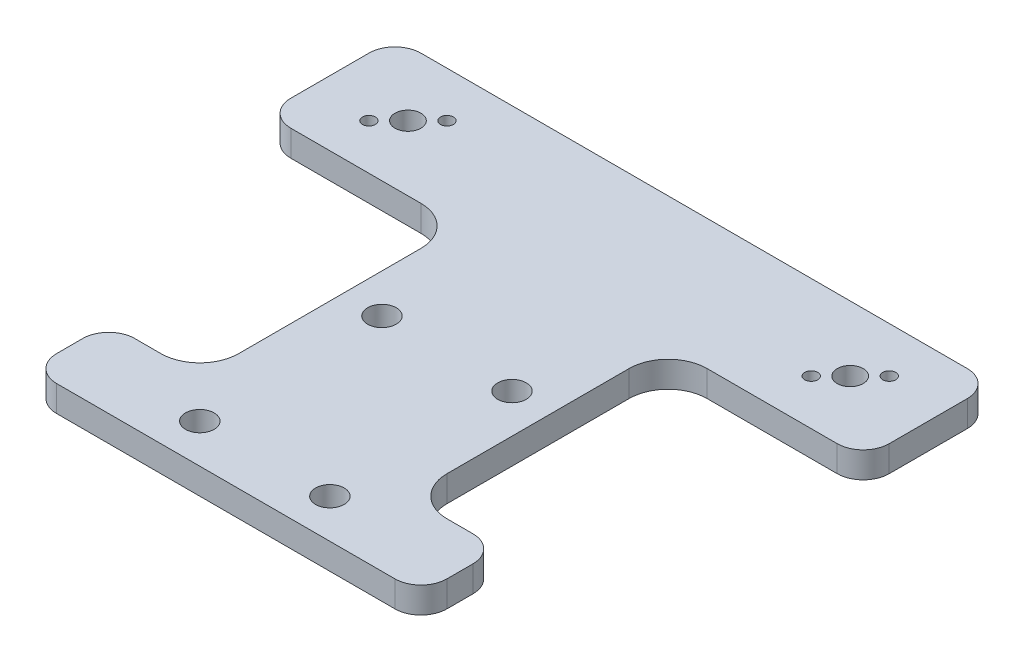
ISO-10303-21;
HEADER;
FILE_DESCRIPTION(('STEP AP214'),'2;1');
FILE_NAME('part.step','',(''),(''),'','','');
FILE_SCHEMA(('AUTOMOTIVE_DESIGN { 1 0 10303 214 1 1 1 1 }'));
ENDSEC;
DATA;
#1=APPLICATION_CONTEXT('core data for automotive mechanical design processes');
#2=APPLICATION_PROTOCOL_DEFINITION('international standard','automotive_design',2000,#1);
#3=PRODUCT_CONTEXT('',#1,'mechanical');
#4=PRODUCT('Part','Part','',(#3));
#5=PRODUCT_RELATED_PRODUCT_CATEGORY('part','',(#4));
#6=PRODUCT_DEFINITION_FORMATION('','',#4);
#7=PRODUCT_DEFINITION_CONTEXT('part definition',#1,'design');
#8=PRODUCT_DEFINITION('design','',#6,#7);
#9=PRODUCT_DEFINITION_SHAPE('','',#8);
#10=(LENGTH_UNIT() NAMED_UNIT(*) SI_UNIT(.MILLI.,.METRE.));
#11=(NAMED_UNIT(*) PLANE_ANGLE_UNIT() SI_UNIT($,.RADIAN.));
#12=(NAMED_UNIT(*) SI_UNIT($,.STERADIAN.) SOLID_ANGLE_UNIT());
#13=UNCERTAINTY_MEASURE_WITH_UNIT(LENGTH_MEASURE(1.E-05),#10,'distance_accuracy_value','');
#14=(GEOMETRIC_REPRESENTATION_CONTEXT(3) GLOBAL_UNCERTAINTY_ASSIGNED_CONTEXT((#13)) GLOBAL_UNIT_ASSIGNED_CONTEXT((#10,
#11,#12)) REPRESENTATION_CONTEXT('',''));
#15=CARTESIAN_POINT('',(0.,0.,0.));
#16=DIRECTION('',(0.,0.,1.));
#17=DIRECTION('',(1.,0.,0.));
#18=AXIS2_PLACEMENT_3D('',#15,#16,#17);
#19=CARTESIAN_POINT('',(55.,0.,-25.));
#20=DIRECTION('',(0.,-1.,0.));
#21=DIRECTION('',(0.,0.,-1.));
#22=AXIS2_PLACEMENT_3D('',#19,#20,#21);
#23=PLANE('',#22);
#24=CARTESIAN_POINT('',(25.,0.,4.99999999999999));
#25=DIRECTION('',(0.,-1.,0.));
#26=DIRECTION('',(0.,0.,-1.));
#27=AXIS2_PLACEMENT_3D('',#24,#25,#26);
#28=CIRCLE('',#27,5.49999999999999);
#29=CARTESIAN_POINT('',(25.,0.,-0.499999999999997));
#30=VERTEX_POINT('',#29);
#31=EDGE_CURVE('E466',#30,#30,#28,.T.);
#32=ORIENTED_EDGE('',*,*,#31,.F.);
#33=EDGE_LOOP('',(#32));
#34=FACE_BOUND('',#33,.T.);
#35=CARTESIAN_POINT('',(25.,0.,75.));
#36=DIRECTION('',(0.,-1.,0.));
#37=DIRECTION('',(0.,0.,-1.));
#38=AXIS2_PLACEMENT_3D('',#35,#36,#37);
#39=CIRCLE('',#38,5.49999999999999);
#40=CARTESIAN_POINT('',(25.,0.,69.5));
#41=VERTEX_POINT('',#40);
#42=EDGE_CURVE('E468',#41,#41,#39,.T.);
#43=ORIENTED_EDGE('',*,*,#42,.F.);
#44=EDGE_LOOP('',(#43));
#45=FACE_BOUND('',#44,.T.);
#46=CARTESIAN_POINT('',(-25.,0.,4.99999999999999));
#47=DIRECTION('',(0.,-1.,0.));
#48=DIRECTION('',(0.,0.,-1.));
#49=AXIS2_PLACEMENT_3D('',#46,#47,#48);
#50=CIRCLE('',#49,5.49999999999999);
#51=CARTESIAN_POINT('',(-25.,0.,-0.499999999999997));
#52=VERTEX_POINT('',#51);
#53=EDGE_CURVE('E476',#52,#52,#50,.T.);
#54=ORIENTED_EDGE('',*,*,#53,.F.);
#55=EDGE_LOOP('',(#54));
#56=FACE_BOUND('',#55,.T.);
#57=CARTESIAN_POINT('',(-25.,0.,75.));
#58=DIRECTION('',(0.,-1.,0.));
#59=DIRECTION('',(0.,0.,-1.));
#60=AXIS2_PLACEMENT_3D('',#57,#58,#59);
#61=CIRCLE('',#60,5.49999999999999);
#62=CARTESIAN_POINT('',(-25.,0.,69.5));
#63=VERTEX_POINT('',#62);
#64=EDGE_CURVE('E482',#63,#63,#61,.T.);
#65=ORIENTED_EDGE('',*,*,#64,.F.);
#66=EDGE_LOOP('',(#65));
#67=FACE_BOUND('',#66,.T.);
#68=CARTESIAN_POINT('',(-77.5,0.,-72.5));
#69=DIRECTION('',(0.,-1.,0.));
#70=DIRECTION('',(0.,0.,-1.));
#71=AXIS2_PLACEMENT_3D('',#68,#69,#70);
#72=CIRCLE('',#71,2.5);
#73=CARTESIAN_POINT('',(-77.5,0.,-75.));
#74=VERTEX_POINT('',#73);
#75=EDGE_CURVE('E488',#74,#74,#72,.T.);
#76=ORIENTED_EDGE('',*,*,#75,.F.);
#77=EDGE_LOOP('',(#76));
#78=FACE_BOUND('',#77,.T.);
#79=CARTESIAN_POINT('',(-92.5,0.,-57.5));
#80=DIRECTION('',(0.,-1.,0.));
#81=DIRECTION('',(0.,0.,-1.));
#82=AXIS2_PLACEMENT_3D('',#79,#80,#81);
#83=CIRCLE('',#82,2.5);
#84=CARTESIAN_POINT('',(-92.5,0.,-60.));
#85=VERTEX_POINT('',#84);
#86=EDGE_CURVE('E494',#85,#85,#83,.T.);
#87=ORIENTED_EDGE('',*,*,#86,.F.);
#88=EDGE_LOOP('',(#87));
#89=FACE_BOUND('',#88,.T.);
#90=CARTESIAN_POINT('',(92.5,0.,-72.5));
#91=DIRECTION('',(0.,-1.,0.));
#92=DIRECTION('',(0.,0.,-1.));
#93=AXIS2_PLACEMENT_3D('',#90,#91,#92);
#94=CIRCLE('',#93,2.5);
#95=CARTESIAN_POINT('',(92.5,0.,-75.));
#96=VERTEX_POINT('',#95);
#97=EDGE_CURVE('E500',#96,#96,#94,.T.);
#98=ORIENTED_EDGE('',*,*,#97,.F.);
#99=EDGE_LOOP('',(#98));
#100=FACE_BOUND('',#99,.T.);
#101=CARTESIAN_POINT('',(77.5,0.,-57.5));
#102=DIRECTION('',(0.,-1.,0.));
#103=DIRECTION('',(0.,0.,-1.));
#104=AXIS2_PLACEMENT_3D('',#101,#102,#103);
#105=CIRCLE('',#104,2.5);
#106=CARTESIAN_POINT('',(77.5,0.,-60.));
#107=VERTEX_POINT('',#106);
#108=EDGE_CURVE('E506',#107,#107,#105,.T.);
#109=ORIENTED_EDGE('',*,*,#108,.F.);
#110=EDGE_LOOP('',(#109));
#111=FACE_BOUND('',#110,.T.);
#112=CARTESIAN_POINT('',(55.,0.,-25.));
#113=DIRECTION('',(0.,-1.,0.));
#114=DIRECTION('',(0.,0.,-1.));
#115=AXIS2_PLACEMENT_3D('',#112,#113,#114);
#116=CIRCLE('',#115,15.);
#117=CARTESIAN_POINT('',(40.,0.,-24.9999999999999));
#118=VERTEX_POINT('',#117);
#119=CARTESIAN_POINT('',(55.0000000000001,0.,-40.));
#120=VERTEX_POINT('',#119);
#121=EDGE_CURVE('E226',#118,#120,#116,.T.);
#122=ORIENTED_EDGE('',*,*,#121,.F.);
#123=DIRECTION('',(0.,0.,-1.));
#124=VECTOR('',#123,1.);
#125=CARTESIAN_POINT('',(40.,0.,-24.9999999999999));
#126=LINE('',#125,#124);
#127=CARTESIAN_POINT('',(40.,0.,44.9999999999999));
#128=VERTEX_POINT('',#127);
#129=EDGE_CURVE('E133',#128,#118,#126,.T.);
#130=ORIENTED_EDGE('',*,*,#129,.F.);
#131=CARTESIAN_POINT('',(55.,0.,45.));
#132=DIRECTION('',(0.,-1.,0.));
#133=DIRECTION('',(0.,0.,-1.));
#134=AXIS2_PLACEMENT_3D('',#131,#132,#133);
#135=CIRCLE('',#134,15.);
#136=CARTESIAN_POINT('',(55.0000000000001,0.,60.));
#137=VERTEX_POINT('',#136);
#138=EDGE_CURVE('E127',#137,#128,#135,.T.);
#139=ORIENTED_EDGE('',*,*,#138,.F.);
#140=DIRECTION('',(-1.,0.,0.));
#141=VECTOR('',#140,1.);
#142=CARTESIAN_POINT('',(55.0000000000001,0.,60.));
#143=LINE('',#142,#141);
#144=CARTESIAN_POINT('',(64.9999999999999,0.,60.));
#145=VERTEX_POINT('',#144);
#146=EDGE_CURVE('E216',#145,#137,#143,.T.);
#147=ORIENTED_EDGE('',*,*,#146,.F.);
#148=CARTESIAN_POINT('',(65.,0.,70.));
#149=DIRECTION('',(0.,1.,0.));
#150=DIRECTION('',(0.,0.,1.));
#151=AXIS2_PLACEMENT_3D('',#148,#149,#150);
#152=CIRCLE('',#151,10.);
#153=CARTESIAN_POINT('',(75.,0.,70.0000000000001));
#154=VERTEX_POINT('',#153);
#155=EDGE_CURVE('E268',#154,#145,#152,.T.);
#156=ORIENTED_EDGE('',*,*,#155,.F.);
#157=DIRECTION('',(0.,0.,-1.));
#158=VECTOR('',#157,1.);
#159=CARTESIAN_POINT('',(75.,0.,70.0000000000001));
#160=LINE('',#159,#158);
#161=CARTESIAN_POINT('',(75.,0.,79.9999999999999));
#162=VERTEX_POINT('',#161);
#163=EDGE_CURVE('E266',#162,#154,#160,.T.);
#164=ORIENTED_EDGE('',*,*,#163,.F.);
#165=CARTESIAN_POINT('',(65.,0.,80.));
#166=DIRECTION('',(0.,1.,0.));
#167=DIRECTION('',(0.,0.,-1.));
#168=AXIS2_PLACEMENT_3D('',#165,#166,#167);
#169=CIRCLE('',#168,10.);
#170=CARTESIAN_POINT('',(64.9999999999999,0.,90.));
#171=VERTEX_POINT('',#170);
#172=EDGE_CURVE('E264',#171,#162,#169,.T.);
#173=ORIENTED_EDGE('',*,*,#172,.F.);
#174=DIRECTION('',(1.,0.,0.));
#175=VECTOR('',#174,1.);
#176=CARTESIAN_POINT('',(-64.9999999999999,0.,90.));
#177=LINE('',#176,#175);
#178=CARTESIAN_POINT('',(-64.9999999999999,0.,90.));
#179=VERTEX_POINT('',#178);
#180=EDGE_CURVE('E262',#179,#171,#177,.T.);
#181=ORIENTED_EDGE('',*,*,#180,.F.);
#182=CARTESIAN_POINT('',(-65.,0.,80.));
#183=DIRECTION('',(0.,1.,0.));
#184=DIRECTION('',(0.,0.,1.));
#185=AXIS2_PLACEMENT_3D('',#182,#183,#184);
#186=CIRCLE('',#185,10.);
#187=CARTESIAN_POINT('',(-75.,0.,79.9999999999999));
#188=VERTEX_POINT('',#187);
#189=EDGE_CURVE('E260',#188,#179,#186,.T.);
#190=ORIENTED_EDGE('',*,*,#189,.F.);
#191=DIRECTION('',(0.,0.,1.));
#192=VECTOR('',#191,1.);
#193=CARTESIAN_POINT('',(-75.,0.,70.0000000000001));
#194=LINE('',#193,#192);
#195=CARTESIAN_POINT('',(-75.,0.,70.0000000000001));
#196=VERTEX_POINT('',#195);
#197=EDGE_CURVE('E258',#196,#188,#194,.T.);
#198=ORIENTED_EDGE('',*,*,#197,.F.);
#199=CARTESIAN_POINT('',(-65.,0.,70.));
#200=DIRECTION('',(0.,1.,0.));
#201=DIRECTION('',(0.,0.,1.));
#202=AXIS2_PLACEMENT_3D('',#199,#200,#201);
#203=CIRCLE('',#202,9.99999999999999);
#204=CARTESIAN_POINT('',(-64.9999999999999,0.,60.));
#205=VERTEX_POINT('',#204);
#206=EDGE_CURVE('E256',#205,#196,#203,.T.);
#207=ORIENTED_EDGE('',*,*,#206,.F.);
#208=DIRECTION('',(-1.,0.,0.));
#209=VECTOR('',#208,1.);
#210=CARTESIAN_POINT('',(-55.0000000000001,0.,60.));
#211=LINE('',#210,#209);
#212=CARTESIAN_POINT('',(-55.0000000000001,0.,60.));
#213=VERTEX_POINT('',#212);
#214=EDGE_CURVE('E254',#213,#205,#211,.T.);
#215=ORIENTED_EDGE('',*,*,#214,.F.);
#216=CARTESIAN_POINT('',(-55.,0.,45.));
#217=DIRECTION('',(0.,-1.,0.));
#218=DIRECTION('',(0.,0.,-1.));
#219=AXIS2_PLACEMENT_3D('',#216,#217,#218);
#220=CIRCLE('',#219,15.);
#221=CARTESIAN_POINT('',(-40.,0.,44.9999999999999));
#222=VERTEX_POINT('',#221);
#223=EDGE_CURVE('E252',#222,#213,#220,.T.);
#224=ORIENTED_EDGE('',*,*,#223,.F.);
#225=DIRECTION('',(0.,0.,1.));
#226=VECTOR('',#225,1.);
#227=CARTESIAN_POINT('',(-40.,0.,-24.9999999999999));
#228=LINE('',#227,#226);
#229=CARTESIAN_POINT('',(-40.,0.,-24.9999999999999));
#230=VERTEX_POINT('',#229);
#231=EDGE_CURVE('E250',#230,#222,#228,.T.);
#232=ORIENTED_EDGE('',*,*,#231,.F.);
#233=CARTESIAN_POINT('',(-55.,0.,-25.));
#234=DIRECTION('',(0.,-1.,0.));
#235=DIRECTION('',(0.,0.,-1.));
#236=AXIS2_PLACEMENT_3D('',#233,#234,#235);
#237=CIRCLE('',#236,15.);
#238=CARTESIAN_POINT('',(-55.0000000000001,0.,-40.));
#239=VERTEX_POINT('',#238);
#240=EDGE_CURVE('E248',#239,#230,#237,.T.);
#241=ORIENTED_EDGE('',*,*,#240,.F.);
#242=DIRECTION('',(1.,0.,0.));
#243=VECTOR('',#242,1.);
#244=CARTESIAN_POINT('',(-105.,0.,-40.));
#245=LINE('',#244,#243);
#246=CARTESIAN_POINT('',(-105.,0.,-40.));
#247=VERTEX_POINT('',#246);
#248=EDGE_CURVE('E246',#247,#239,#245,.T.);
#249=ORIENTED_EDGE('',*,*,#248,.F.);
#250=CARTESIAN_POINT('',(-105.,0.,-50.));
#251=DIRECTION('',(0.,1.,0.));
#252=DIRECTION('',(0.,0.,1.));
#253=AXIS2_PLACEMENT_3D('',#250,#251,#252);
#254=CIRCLE('',#253,9.99999999999999);
#255=CARTESIAN_POINT('',(-115.,0.,-50.0000000000001));
#256=VERTEX_POINT('',#255);
#257=EDGE_CURVE('E244',#256,#247,#254,.T.);
#258=ORIENTED_EDGE('',*,*,#257,.F.);
#259=DIRECTION('',(0.,0.,1.));
#260=VECTOR('',#259,1.);
#261=CARTESIAN_POINT('',(-115.,0.,-79.9999999999999));
#262=LINE('',#261,#260);
#263=CARTESIAN_POINT('',(-115.,0.,-79.9999999999999));
#264=VERTEX_POINT('',#263);
#265=EDGE_CURVE('E242',#264,#256,#262,.T.);
#266=ORIENTED_EDGE('',*,*,#265,.F.);
#267=CARTESIAN_POINT('',(-105.,0.,-80.));
#268=DIRECTION('',(0.,1.,0.));
#269=DIRECTION('',(0.,0.,1.));
#270=AXIS2_PLACEMENT_3D('',#267,#268,#269);
#271=CIRCLE('',#270,9.99999999999999);
#272=CARTESIAN_POINT('',(-105.,0.,-90.));
#273=VERTEX_POINT('',#272);
#274=EDGE_CURVE('E240',#273,#264,#271,.T.);
#275=ORIENTED_EDGE('',*,*,#274,.F.);
#276=DIRECTION('',(-1.,0.,0.));
#277=VECTOR('',#276,1.);
#278=CARTESIAN_POINT('',(-105.,0.,-90.));
#279=LINE('',#278,#277);
#280=CARTESIAN_POINT('',(105.,0.,-90.));
#281=VERTEX_POINT('',#280);
#282=EDGE_CURVE('E238',#281,#273,#279,.T.);
#283=ORIENTED_EDGE('',*,*,#282,.F.);
#284=CARTESIAN_POINT('',(105.,0.,-80.));
#285=DIRECTION('',(0.,1.,0.));
#286=DIRECTION('',(0.,0.,1.));
#287=AXIS2_PLACEMENT_3D('',#284,#285,#286);
#288=CIRCLE('',#287,9.99999999999999);
#289=CARTESIAN_POINT('',(115.,0.,-79.9999999999999));
#290=VERTEX_POINT('',#289);
#291=EDGE_CURVE('E236',#290,#281,#288,.T.);
#292=ORIENTED_EDGE('',*,*,#291,.F.);
#293=DIRECTION('',(0.,0.,-1.));
#294=VECTOR('',#293,1.);
#295=CARTESIAN_POINT('',(115.,0.,-79.9999999999999));
#296=LINE('',#295,#294);
#297=CARTESIAN_POINT('',(115.,0.,-50.0000000000001));
#298=VERTEX_POINT('',#297);
#299=EDGE_CURVE('E234',#298,#290,#296,.T.);
#300=ORIENTED_EDGE('',*,*,#299,.F.);
#301=CARTESIAN_POINT('',(105.,0.,-50.));
#302=DIRECTION('',(0.,1.,0.));
#303=DIRECTION('',(0.,0.,1.));
#304=AXIS2_PLACEMENT_3D('',#301,#302,#303);
#305=CIRCLE('',#304,9.99999999999999);
#306=CARTESIAN_POINT('',(105.,0.,-40.));
#307=VERTEX_POINT('',#306);
#308=EDGE_CURVE('E232',#307,#298,#305,.T.);
#309=ORIENTED_EDGE('',*,*,#308,.F.);
#310=DIRECTION('',(1.,0.,0.));
#311=VECTOR('',#310,1.);
#312=CARTESIAN_POINT('',(105.,0.,-40.));
#313=LINE('',#312,#311);
#314=EDGE_CURVE('E229',#120,#307,#313,.T.);
#315=ORIENTED_EDGE('',*,*,#314,.F.);
#316=EDGE_LOOP('',(#122,#130,#139,#147,#156,#164,#173,#181,#190,#198,#207,#215,#224,#232,#241,
#249,#258,#266,#275,#283,#292,#300,#309,#315));
#317=FACE_BOUND('',#316,.T.);
#318=CARTESIAN_POINT('',(85.,0.,-65.));
#319=DIRECTION('',(0.,1.,0.));
#320=DIRECTION('',(0.,0.,1.));
#321=AXIS2_PLACEMENT_3D('',#318,#319,#320);
#322=CIRCLE('',#321,5.);
#323=CARTESIAN_POINT('',(85.,0.,-60.));
#324=VERTEX_POINT('',#323);
#325=EDGE_CURVE('E230',#324,#324,#322,.T.);
#326=ORIENTED_EDGE('',*,*,#325,.T.);
#327=EDGE_LOOP('',(#326));
#328=FACE_BOUND('',#327,.T.);
#329=CARTESIAN_POINT('',(-85.,0.,-65.));
#330=DIRECTION('',(0.,1.,0.));
#331=DIRECTION('',(0.,0.,1.));
#332=AXIS2_PLACEMENT_3D('',#329,#330,#331);
#333=CIRCLE('',#332,5.);
#334=CARTESIAN_POINT('',(-85.,0.,-60.));
#335=VERTEX_POINT('',#334);
#336=EDGE_CURVE('E515',#335,#335,#333,.T.);
#337=ORIENTED_EDGE('',*,*,#336,.T.);
#338=EDGE_LOOP('',(#337));
#339=FACE_BOUND('',#338,.T.);
#340=ADVANCED_FACE('F33',(#34,#45,#56,#67,#78,#89,#100,#111,#317,#328,#339),#23,.T.);
#341=CARTESIAN_POINT('',(55.,10.,-25.));
#342=DIRECTION('',(0.,-1.,0.));
#343=DIRECTION('',(0.,0.,-1.));
#344=AXIS2_PLACEMENT_3D('',#341,#342,#343);
#345=CYLINDRICAL_SURFACE('',#344,15.);
#346=ORIENTED_EDGE('',*,*,#121,.T.);
#347=DIRECTION('',(0.,-1.,0.));
#348=VECTOR('',#347,1.);
#349=CARTESIAN_POINT('',(55.0000000000001,10.,-40.));
#350=LINE('',#349,#348);
#351=CARTESIAN_POINT('',(55.0000000000001,10.,-40.));
#352=VERTEX_POINT('',#351);
#353=EDGE_CURVE('E11',#352,#120,#350,.T.);
#354=ORIENTED_EDGE('',*,*,#353,.F.);
#355=CARTESIAN_POINT('',(55.,10.,-25.));
#356=DIRECTION('',(0.,-1.,0.));
#357=DIRECTION('',(0.,0.,-1.));
#358=AXIS2_PLACEMENT_3D('',#355,#356,#357);
#359=CIRCLE('',#358,15.);
#360=CARTESIAN_POINT('',(40.,10.,-24.9999999999999));
#361=VERTEX_POINT('',#360);
#362=EDGE_CURVE('E273',#361,#352,#359,.T.);
#363=ORIENTED_EDGE('',*,*,#362,.F.);
#364=DIRECTION('',(0.,-1.,0.));
#365=VECTOR('',#364,1.);
#366=CARTESIAN_POINT('',(40.,10.,-24.9999999999999));
#367=LINE('',#366,#365);
#368=EDGE_CURVE('E222',#361,#118,#367,.T.);
#369=ORIENTED_EDGE('',*,*,#368,.T.);
#370=EDGE_LOOP('',(#346,#354,#363,#369));
#371=FACE_BOUND('',#370,.T.);
#372=ADVANCED_FACE('F35',(#371),#345,.F.);
#373=CARTESIAN_POINT('',(105.,10.,-40.));
#374=DIRECTION('',(0.,0.,-1.));
#375=DIRECTION('',(-1.,0.,0.));
#376=AXIS2_PLACEMENT_3D('',#373,#374,#375);
#377=PLANE('',#376);
#378=ORIENTED_EDGE('',*,*,#314,.T.);
#379=DIRECTION('',(0.,-1.,0.));
#380=VECTOR('',#379,1.);
#381=CARTESIAN_POINT('',(105.,10.,-40.));
#382=LINE('',#381,#380);
#383=CARTESIAN_POINT('',(105.,10.,-40.));
#384=VERTEX_POINT('',#383);
#385=EDGE_CURVE('E42',#384,#307,#382,.T.);
#386=ORIENTED_EDGE('',*,*,#385,.F.);
#387=DIRECTION('',(1.,0.,0.));
#388=VECTOR('',#387,1.);
#389=CARTESIAN_POINT('',(105.,10.,-40.));
#390=LINE('',#389,#388);
#391=EDGE_CURVE('E141',#352,#384,#390,.T.);
#392=ORIENTED_EDGE('',*,*,#391,.F.);
#393=ORIENTED_EDGE('',*,*,#353,.T.);
#394=EDGE_LOOP('',(#378,#386,#392,#393));
#395=FACE_BOUND('',#394,.T.);
#396=ADVANCED_FACE('F417',(#395),#377,.F.);
#397=CARTESIAN_POINT('',(105.,10.,-50.));
#398=DIRECTION('',(0.,-1.,0.));
#399=DIRECTION('',(0.,0.,-1.));
#400=AXIS2_PLACEMENT_3D('',#397,#398,#399);
#401=CYLINDRICAL_SURFACE('',#400,9.99999999999999);
#402=ORIENTED_EDGE('',*,*,#308,.T.);
#403=DIRECTION('',(0.,-1.,0.));
#404=VECTOR('',#403,1.);
#405=CARTESIAN_POINT('',(115.,10.,-50.0000000000001));
#406=LINE('',#405,#404);
#407=CARTESIAN_POINT('',(115.,10.,-50.0000000000001));
#408=VERTEX_POINT('',#407);
#409=EDGE_CURVE('E328',#408,#298,#406,.T.);
#410=ORIENTED_EDGE('',*,*,#409,.F.);
#411=CARTESIAN_POINT('',(105.,10.,-50.));
#412=DIRECTION('',(0.,1.,0.));
#413=DIRECTION('',(0.,0.,1.));
#414=AXIS2_PLACEMENT_3D('',#411,#412,#413);
#415=CIRCLE('',#414,9.99999999999999);
#416=EDGE_CURVE('E336',#384,#408,#415,.T.);
#417=ORIENTED_EDGE('',*,*,#416,.F.);
#418=ORIENTED_EDGE('',*,*,#385,.T.);
#419=EDGE_LOOP('',(#402,#410,#417,#418));
#420=FACE_BOUND('',#419,.T.);
#421=ADVANCED_FACE('F334',(#420),#401,.T.);
#422=CARTESIAN_POINT('',(115.,10.,-79.9999999999999));
#423=DIRECTION('',(-1.,0.,0.));
#424=DIRECTION('',(0.,0.,1.));
#425=AXIS2_PLACEMENT_3D('',#422,#423,#424);
#426=PLANE('',#425);
#427=ORIENTED_EDGE('',*,*,#299,.T.);
#428=DIRECTION('',(0.,-1.,0.));
#429=VECTOR('',#428,1.);
#430=CARTESIAN_POINT('',(115.,10.,-79.9999999999999));
#431=LINE('',#430,#429);
#432=CARTESIAN_POINT('',(115.,10.,-79.9999999999999));
#433=VERTEX_POINT('',#432);
#434=EDGE_CURVE('E325',#433,#290,#431,.T.);
#435=ORIENTED_EDGE('',*,*,#434,.F.);
#436=DIRECTION('',(0.,0.,-1.));
#437=VECTOR('',#436,1.);
#438=CARTESIAN_POINT('',(115.,10.,-79.9999999999999));
#439=LINE('',#438,#437);
#440=EDGE_CURVE('E354',#408,#433,#439,.T.);
#441=ORIENTED_EDGE('',*,*,#440,.F.);
#442=ORIENTED_EDGE('',*,*,#409,.T.);
#443=EDGE_LOOP('',(#427,#435,#441,#442));
#444=FACE_BOUND('',#443,.T.);
#445=ADVANCED_FACE('F345',(#444),#426,.F.);
#446=CARTESIAN_POINT('',(105.,10.,-80.));
#447=DIRECTION('',(0.,-1.,0.));
#448=DIRECTION('',(0.,0.,-1.));
#449=AXIS2_PLACEMENT_3D('',#446,#447,#448);
#450=CYLINDRICAL_SURFACE('',#449,9.99999999999999);
#451=ORIENTED_EDGE('',*,*,#291,.T.);
#452=DIRECTION('',(0.,-1.,0.));
#453=VECTOR('',#452,1.);
#454=CARTESIAN_POINT('',(105.,10.,-90.));
#455=LINE('',#454,#453);
#456=CARTESIAN_POINT('',(105.,10.,-90.));
#457=VERTEX_POINT('',#456);
#458=EDGE_CURVE('E322',#457,#281,#455,.T.);
#459=ORIENTED_EDGE('',*,*,#458,.F.);
#460=CARTESIAN_POINT('',(105.,10.,-80.));
#461=DIRECTION('',(0.,1.,0.));
#462=DIRECTION('',(0.,0.,1.));
#463=AXIS2_PLACEMENT_3D('',#460,#461,#462);
#464=CIRCLE('',#463,9.99999999999999);
#465=EDGE_CURVE('E351',#433,#457,#464,.T.);
#466=ORIENTED_EDGE('',*,*,#465,.F.);
#467=ORIENTED_EDGE('',*,*,#434,.T.);
#468=EDGE_LOOP('',(#451,#459,#466,#467));
#469=FACE_BOUND('',#468,.T.);
#470=ADVANCED_FACE('F349',(#469),#450,.T.);
#471=CARTESIAN_POINT('',(-105.,10.,-90.));
#472=DIRECTION('',(0.,0.,1.));
#473=DIRECTION('',(1.,0.,0.));
#474=AXIS2_PLACEMENT_3D('',#471,#472,#473);
#475=PLANE('',#474);
#476=ORIENTED_EDGE('',*,*,#282,.T.);
#477=DIRECTION('',(0.,-1.,0.));
#478=VECTOR('',#477,1.);
#479=CARTESIAN_POINT('',(-105.,10.,-90.));
#480=LINE('',#479,#478);
#481=CARTESIAN_POINT('',(-105.,10.,-90.));
#482=VERTEX_POINT('',#481);
#483=EDGE_CURVE('E319',#482,#273,#480,.T.);
#484=ORIENTED_EDGE('',*,*,#483,.F.);
#485=DIRECTION('',(-1.,0.,0.));
#486=VECTOR('',#485,1.);
#487=CARTESIAN_POINT('',(-105.,10.,-90.));
#488=LINE('',#487,#486);
#489=EDGE_CURVE('E353',#457,#482,#488,.T.);
#490=ORIENTED_EDGE('',*,*,#489,.F.);
#491=ORIENTED_EDGE('',*,*,#458,.T.);
#492=EDGE_LOOP('',(#476,#484,#490,#491));
#493=FACE_BOUND('',#492,.T.);
#494=ADVANCED_FACE('F780',(#493),#475,.F.);
#495=CARTESIAN_POINT('',(-105.,10.,-80.));
#496=DIRECTION('',(0.,-1.,0.));
#497=DIRECTION('',(0.,0.,-1.));
#498=AXIS2_PLACEMENT_3D('',#495,#496,#497);
#499=CYLINDRICAL_SURFACE('',#498,9.99999999999999);
#500=ORIENTED_EDGE('',*,*,#274,.T.);
#501=DIRECTION('',(0.,-1.,0.));
#502=VECTOR('',#501,1.);
#503=CARTESIAN_POINT('',(-115.,10.,-79.9999999999999));
#504=LINE('',#503,#502);
#505=CARTESIAN_POINT('',(-115.,10.,-79.9999999999999));
#506=VERTEX_POINT('',#505);
#507=EDGE_CURVE('E316',#506,#264,#504,.T.);
#508=ORIENTED_EDGE('',*,*,#507,.F.);
#509=CARTESIAN_POINT('',(-105.,10.,-80.));
#510=DIRECTION('',(0.,1.,0.));
#511=DIRECTION('',(0.,0.,1.));
#512=AXIS2_PLACEMENT_3D('',#509,#510,#511);
#513=CIRCLE('',#512,9.99999999999999);
#514=EDGE_CURVE('E356',#482,#506,#513,.T.);
#515=ORIENTED_EDGE('',*,*,#514,.F.);
#516=ORIENTED_EDGE('',*,*,#483,.T.);
#517=EDGE_LOOP('',(#500,#508,#515,#516));
#518=FACE_BOUND('',#517,.T.);
#519=ADVANCED_FACE('F771',(#518),#499,.T.);
#520=CARTESIAN_POINT('',(-115.,10.,-79.9999999999999));
#521=DIRECTION('',(1.,0.,0.));
#522=DIRECTION('',(0.,0.,-1.));
#523=AXIS2_PLACEMENT_3D('',#520,#521,#522);
#524=PLANE('',#523);
#525=ORIENTED_EDGE('',*,*,#265,.T.);
#526=DIRECTION('',(0.,-1.,0.));
#527=VECTOR('',#526,1.);
#528=CARTESIAN_POINT('',(-115.,10.,-50.0000000000001));
#529=LINE('',#528,#527);
#530=CARTESIAN_POINT('',(-115.,10.,-50.0000000000001));
#531=VERTEX_POINT('',#530);
#532=EDGE_CURVE('E313',#531,#256,#529,.T.);
#533=ORIENTED_EDGE('',*,*,#532,.F.);
#534=DIRECTION('',(0.,0.,1.));
#535=VECTOR('',#534,1.);
#536=CARTESIAN_POINT('',(-115.,10.,-79.9999999999999));
#537=LINE('',#536,#535);
#538=EDGE_CURVE('E362',#506,#531,#537,.T.);
#539=ORIENTED_EDGE('',*,*,#538,.F.);
#540=ORIENTED_EDGE('',*,*,#507,.T.);
#541=EDGE_LOOP('',(#525,#533,#539,#540));
#542=FACE_BOUND('',#541,.T.);
#543=ADVANCED_FACE('F762',(#542),#524,.F.);
#544=CARTESIAN_POINT('',(-105.,10.,-50.));
#545=DIRECTION('',(0.,-1.,0.));
#546=DIRECTION('',(0.,0.,-1.));
#547=AXIS2_PLACEMENT_3D('',#544,#545,#546);
#548=CYLINDRICAL_SURFACE('',#547,9.99999999999999);
#549=ORIENTED_EDGE('',*,*,#257,.T.);
#550=DIRECTION('',(0.,-1.,0.));
#551=VECTOR('',#550,1.);
#552=CARTESIAN_POINT('',(-105.,10.,-40.));
#553=LINE('',#552,#551);
#554=CARTESIAN_POINT('',(-105.,10.,-40.));
#555=VERTEX_POINT('',#554);
#556=EDGE_CURVE('E310',#555,#247,#553,.T.);
#557=ORIENTED_EDGE('',*,*,#556,.F.);
#558=CARTESIAN_POINT('',(-105.,10.,-50.));
#559=DIRECTION('',(0.,1.,0.));
#560=DIRECTION('',(0.,0.,1.));
#561=AXIS2_PLACEMENT_3D('',#558,#559,#560);
#562=CIRCLE('',#561,9.99999999999999);
#563=EDGE_CURVE('E364',#531,#555,#562,.T.);
#564=ORIENTED_EDGE('',*,*,#563,.F.);
#565=ORIENTED_EDGE('',*,*,#532,.T.);
#566=EDGE_LOOP('',(#549,#557,#564,#565));
#567=FACE_BOUND('',#566,.T.);
#568=ADVANCED_FACE('F753',(#567),#548,.T.);
#569=CARTESIAN_POINT('',(-105.,10.,-40.));
#570=DIRECTION('',(0.,0.,-1.));
#571=DIRECTION('',(-1.,0.,0.));
#572=AXIS2_PLACEMENT_3D('',#569,#570,#571);
#573=PLANE('',#572);
#574=ORIENTED_EDGE('',*,*,#248,.T.);
#575=DIRECTION('',(0.,-1.,0.));
#576=VECTOR('',#575,1.);
#577=CARTESIAN_POINT('',(-55.0000000000001,10.,-40.));
#578=LINE('',#577,#576);
#579=CARTESIAN_POINT('',(-55.0000000000001,10.,-40.));
#580=VERTEX_POINT('',#579);
#581=EDGE_CURVE('E307',#580,#239,#578,.T.);
#582=ORIENTED_EDGE('',*,*,#581,.F.);
#583=DIRECTION('',(1.,0.,0.));
#584=VECTOR('',#583,1.);
#585=CARTESIAN_POINT('',(-105.,10.,-40.));
#586=LINE('',#585,#584);
#587=EDGE_CURVE('E366',#555,#580,#586,.T.);
#588=ORIENTED_EDGE('',*,*,#587,.F.);
#589=ORIENTED_EDGE('',*,*,#556,.T.);
#590=EDGE_LOOP('',(#574,#582,#588,#589));
#591=FACE_BOUND('',#590,.T.);
#592=ADVANCED_FACE('F744',(#591),#573,.F.);
#593=CARTESIAN_POINT('',(-55.,10.,-25.));
#594=DIRECTION('',(0.,-1.,0.));
#595=DIRECTION('',(0.,0.,-1.));
#596=AXIS2_PLACEMENT_3D('',#593,#594,#595);
#597=CYLINDRICAL_SURFACE('',#596,15.);
#598=ORIENTED_EDGE('',*,*,#240,.T.);
#599=DIRECTION('',(0.,-1.,0.));
#600=VECTOR('',#599,1.);
#601=CARTESIAN_POINT('',(-40.,10.,-24.9999999999999));
#602=LINE('',#601,#600);
#603=CARTESIAN_POINT('',(-40.,10.,-24.9999999999999));
#604=VERTEX_POINT('',#603);
#605=EDGE_CURVE('E304',#604,#230,#602,.T.);
#606=ORIENTED_EDGE('',*,*,#605,.F.);
#607=CARTESIAN_POINT('',(-55.,10.,-25.));
#608=DIRECTION('',(0.,-1.,0.));
#609=DIRECTION('',(0.,0.,-1.));
#610=AXIS2_PLACEMENT_3D('',#607,#608,#609);
#611=CIRCLE('',#610,15.);
#612=EDGE_CURVE('E368',#580,#604,#611,.T.);
#613=ORIENTED_EDGE('',*,*,#612,.F.);
#614=ORIENTED_EDGE('',*,*,#581,.T.);
#615=EDGE_LOOP('',(#598,#606,#613,#614));
#616=FACE_BOUND('',#615,.T.);
#617=ADVANCED_FACE('F735',(#616),#597,.F.);
#618=CARTESIAN_POINT('',(-40.,10.,-24.9999999999999));
#619=DIRECTION('',(1.,0.,0.));
#620=DIRECTION('',(0.,0.,-1.));
#621=AXIS2_PLACEMENT_3D('',#618,#619,#620);
#622=PLANE('',#621);
#623=ORIENTED_EDGE('',*,*,#231,.T.);
#624=DIRECTION('',(0.,-1.,0.));
#625=VECTOR('',#624,1.);
#626=CARTESIAN_POINT('',(-40.,10.,44.9999999999999));
#627=LINE('',#626,#625);
#628=CARTESIAN_POINT('',(-40.,10.,44.9999999999999));
#629=VERTEX_POINT('',#628);
#630=EDGE_CURVE('E301',#629,#222,#627,.T.);
#631=ORIENTED_EDGE('',*,*,#630,.F.);
#632=DIRECTION('',(0.,0.,1.));
#633=VECTOR('',#632,1.);
#634=CARTESIAN_POINT('',(-40.,10.,-24.9999999999999));
#635=LINE('',#634,#633);
#636=EDGE_CURVE('E370',#604,#629,#635,.T.);
#637=ORIENTED_EDGE('',*,*,#636,.F.);
#638=ORIENTED_EDGE('',*,*,#605,.T.);
#639=EDGE_LOOP('',(#623,#631,#637,#638));
#640=FACE_BOUND('',#639,.T.);
#641=ADVANCED_FACE('F726',(#640),#622,.F.);
#642=CARTESIAN_POINT('',(-55.,10.,45.));
#643=DIRECTION('',(0.,-1.,0.));
#644=DIRECTION('',(0.,0.,-1.));
#645=AXIS2_PLACEMENT_3D('',#642,#643,#644);
#646=CYLINDRICAL_SURFACE('',#645,15.);
#647=ORIENTED_EDGE('',*,*,#223,.T.);
#648=DIRECTION('',(0.,-1.,0.));
#649=VECTOR('',#648,1.);
#650=CARTESIAN_POINT('',(-55.0000000000001,10.,60.));
#651=LINE('',#650,#649);
#652=CARTESIAN_POINT('',(-55.0000000000001,10.,60.));
#653=VERTEX_POINT('',#652);
#654=EDGE_CURVE('E298',#653,#213,#651,.T.);
#655=ORIENTED_EDGE('',*,*,#654,.F.);
#656=CARTESIAN_POINT('',(-55.,10.,45.));
#657=DIRECTION('',(0.,-1.,0.));
#658=DIRECTION('',(0.,0.,-1.));
#659=AXIS2_PLACEMENT_3D('',#656,#657,#658);
#660=CIRCLE('',#659,15.);
#661=EDGE_CURVE('E372',#629,#653,#660,.T.);
#662=ORIENTED_EDGE('',*,*,#661,.F.);
#663=ORIENTED_EDGE('',*,*,#630,.T.);
#664=EDGE_LOOP('',(#647,#655,#662,#663));
#665=FACE_BOUND('',#664,.T.);
#666=ADVANCED_FACE('F717',(#665),#646,.F.);
#667=CARTESIAN_POINT('',(-55.0000000000001,10.,60.));
#668=DIRECTION('',(0.,0.,1.));
#669=DIRECTION('',(1.,0.,0.));
#670=AXIS2_PLACEMENT_3D('',#667,#668,#669);
#671=PLANE('',#670);
#672=ORIENTED_EDGE('',*,*,#214,.T.);
#673=DIRECTION('',(0.,-1.,0.));
#674=VECTOR('',#673,1.);
#675=CARTESIAN_POINT('',(-64.9999999999999,10.,60.));
#676=LINE('',#675,#674);
#677=CARTESIAN_POINT('',(-64.9999999999999,10.,60.));
#678=VERTEX_POINT('',#677);
#679=EDGE_CURVE('E295',#678,#205,#676,.T.);
#680=ORIENTED_EDGE('',*,*,#679,.F.);
#681=DIRECTION('',(-1.,0.,0.));
#682=VECTOR('',#681,1.);
#683=CARTESIAN_POINT('',(-55.0000000000001,10.,60.));
#684=LINE('',#683,#682);
#685=EDGE_CURVE('E374',#653,#678,#684,.T.);
#686=ORIENTED_EDGE('',*,*,#685,.F.);
#687=ORIENTED_EDGE('',*,*,#654,.T.);
#688=EDGE_LOOP('',(#672,#680,#686,#687));
#689=FACE_BOUND('',#688,.T.);
#690=ADVANCED_FACE('F708',(#689),#671,.F.);
#691=CARTESIAN_POINT('',(-65.,10.,70.));
#692=DIRECTION('',(0.,-1.,0.));
#693=DIRECTION('',(0.,0.,-1.));
#694=AXIS2_PLACEMENT_3D('',#691,#692,#693);
#695=CYLINDRICAL_SURFACE('',#694,9.99999999999999);
#696=ORIENTED_EDGE('',*,*,#206,.T.);
#697=DIRECTION('',(0.,-1.,0.));
#698=VECTOR('',#697,1.);
#699=CARTESIAN_POINT('',(-75.,10.,70.0000000000001));
#700=LINE('',#699,#698);
#701=CARTESIAN_POINT('',(-75.,10.,70.0000000000001));
#702=VERTEX_POINT('',#701);
#703=EDGE_CURVE('E292',#702,#196,#700,.T.);
#704=ORIENTED_EDGE('',*,*,#703,.F.);
#705=CARTESIAN_POINT('',(-65.,10.,70.));
#706=DIRECTION('',(0.,1.,0.));
#707=DIRECTION('',(0.,0.,1.));
#708=AXIS2_PLACEMENT_3D('',#705,#706,#707);
#709=CIRCLE('',#708,9.99999999999999);
#710=EDGE_CURVE('E376',#678,#702,#709,.T.);
#711=ORIENTED_EDGE('',*,*,#710,.F.);
#712=ORIENTED_EDGE('',*,*,#679,.T.);
#713=EDGE_LOOP('',(#696,#704,#711,#712));
#714=FACE_BOUND('',#713,.T.);
#715=ADVANCED_FACE('F699',(#714),#695,.T.);
#716=CARTESIAN_POINT('',(-75.,10.,70.0000000000001));
#717=DIRECTION('',(1.,0.,0.));
#718=DIRECTION('',(0.,0.,-1.));
#719=AXIS2_PLACEMENT_3D('',#716,#717,#718);
#720=PLANE('',#719);
#721=ORIENTED_EDGE('',*,*,#197,.T.);
#722=DIRECTION('',(0.,-1.,0.));
#723=VECTOR('',#722,1.);
#724=CARTESIAN_POINT('',(-75.,10.,79.9999999999999));
#725=LINE('',#724,#723);
#726=CARTESIAN_POINT('',(-75.,10.,79.9999999999999));
#727=VERTEX_POINT('',#726);
#728=EDGE_CURVE('E289',#727,#188,#725,.T.);
#729=ORIENTED_EDGE('',*,*,#728,.F.);
#730=DIRECTION('',(0.,0.,1.));
#731=VECTOR('',#730,1.);
#732=CARTESIAN_POINT('',(-75.,10.,70.0000000000001));
#733=LINE('',#732,#731);
#734=EDGE_CURVE('E378',#702,#727,#733,.T.);
#735=ORIENTED_EDGE('',*,*,#734,.F.);
#736=ORIENTED_EDGE('',*,*,#703,.T.);
#737=EDGE_LOOP('',(#721,#729,#735,#736));
#738=FACE_BOUND('',#737,.T.);
#739=ADVANCED_FACE('F690',(#738),#720,.F.);
#740=CARTESIAN_POINT('',(-65.,10.,80.));
#741=DIRECTION('',(0.,-1.,0.));
#742=DIRECTION('',(0.,0.,-1.));
#743=AXIS2_PLACEMENT_3D('',#740,#741,#742);
#744=CYLINDRICAL_SURFACE('',#743,10.);
#745=ORIENTED_EDGE('',*,*,#189,.T.);
#746=DIRECTION('',(0.,-1.,0.));
#747=VECTOR('',#746,1.);
#748=CARTESIAN_POINT('',(-64.9999999999999,10.,90.));
#749=LINE('',#748,#747);
#750=CARTESIAN_POINT('',(-64.9999999999999,10.,90.));
#751=VERTEX_POINT('',#750);
#752=EDGE_CURVE('E286',#751,#179,#749,.T.);
#753=ORIENTED_EDGE('',*,*,#752,.F.);
#754=CARTESIAN_POINT('',(-65.,10.,80.));
#755=DIRECTION('',(0.,1.,0.));
#756=DIRECTION('',(0.,0.,1.));
#757=AXIS2_PLACEMENT_3D('',#754,#755,#756);
#758=CIRCLE('',#757,10.);
#759=EDGE_CURVE('E380',#727,#751,#758,.T.);
#760=ORIENTED_EDGE('',*,*,#759,.F.);
#761=ORIENTED_EDGE('',*,*,#728,.T.);
#762=EDGE_LOOP('',(#745,#753,#760,#761));
#763=FACE_BOUND('',#762,.T.);
#764=ADVANCED_FACE('F681',(#763),#744,.T.);
#765=CARTESIAN_POINT('',(-64.9999999999999,10.,90.));
#766=DIRECTION('',(0.,0.,-1.));
#767=DIRECTION('',(-1.,0.,0.));
#768=AXIS2_PLACEMENT_3D('',#765,#766,#767);
#769=PLANE('',#768);
#770=ORIENTED_EDGE('',*,*,#180,.T.);
#771=DIRECTION('',(0.,-1.,0.));
#772=VECTOR('',#771,1.);
#773=CARTESIAN_POINT('',(64.9999999999999,10.,90.));
#774=LINE('',#773,#772);
#775=CARTESIAN_POINT('',(64.9999999999999,10.,90.));
#776=VERTEX_POINT('',#775);
#777=EDGE_CURVE('E283',#776,#171,#774,.T.);
#778=ORIENTED_EDGE('',*,*,#777,.F.);
#779=DIRECTION('',(1.,0.,0.));
#780=VECTOR('',#779,1.);
#781=CARTESIAN_POINT('',(-64.9999999999999,10.,90.));
#782=LINE('',#781,#780);
#783=EDGE_CURVE('E382',#751,#776,#782,.T.);
#784=ORIENTED_EDGE('',*,*,#783,.F.);
#785=ORIENTED_EDGE('',*,*,#752,.T.);
#786=EDGE_LOOP('',(#770,#778,#784,#785));
#787=FACE_BOUND('',#786,.T.);
#788=ADVANCED_FACE('F672',(#787),#769,.F.);
#789=CARTESIAN_POINT('',(65.,10.,80.));
#790=DIRECTION('',(0.,-1.,0.));
#791=DIRECTION('',(0.,0.,-1.));
#792=AXIS2_PLACEMENT_3D('',#789,#790,#791);
#793=CYLINDRICAL_SURFACE('',#792,10.);
#794=ORIENTED_EDGE('',*,*,#172,.T.);
#795=DIRECTION('',(0.,-1.,0.));
#796=VECTOR('',#795,1.);
#797=CARTESIAN_POINT('',(75.,10.,79.9999999999999));
#798=LINE('',#797,#796);
#799=CARTESIAN_POINT('',(75.,10.,79.9999999999999));
#800=VERTEX_POINT('',#799);
#801=EDGE_CURVE('E280',#800,#162,#798,.T.);
#802=ORIENTED_EDGE('',*,*,#801,.F.);
#803=CARTESIAN_POINT('',(65.,10.,80.));
#804=DIRECTION('',(0.,1.,0.));
#805=DIRECTION('',(0.,0.,-1.));
#806=AXIS2_PLACEMENT_3D('',#803,#804,#805);
#807=CIRCLE('',#806,10.);
#808=EDGE_CURVE('E384',#776,#800,#807,.T.);
#809=ORIENTED_EDGE('',*,*,#808,.F.);
#810=ORIENTED_EDGE('',*,*,#777,.T.);
#811=EDGE_LOOP('',(#794,#802,#809,#810));
#812=FACE_BOUND('',#811,.T.);
#813=ADVANCED_FACE('F664',(#812),#793,.T.);
#814=CARTESIAN_POINT('',(75.,10.,70.0000000000001));
#815=DIRECTION('',(-1.,0.,0.));
#816=DIRECTION('',(0.,0.,1.));
#817=AXIS2_PLACEMENT_3D('',#814,#815,#816);
#818=PLANE('',#817);
#819=ORIENTED_EDGE('',*,*,#163,.T.);
#820=DIRECTION('',(0.,-1.,0.));
#821=VECTOR('',#820,1.);
#822=CARTESIAN_POINT('',(75.,10.,70.0000000000001));
#823=LINE('',#822,#821);
#824=CARTESIAN_POINT('',(75.,10.,70.0000000000001));
#825=VERTEX_POINT('',#824);
#826=EDGE_CURVE('E277',#825,#154,#823,.T.);
#827=ORIENTED_EDGE('',*,*,#826,.F.);
#828=DIRECTION('',(0.,0.,-1.));
#829=VECTOR('',#828,1.);
#830=CARTESIAN_POINT('',(75.,10.,70.0000000000001));
#831=LINE('',#830,#829);
#832=EDGE_CURVE('E386',#800,#825,#831,.T.);
#833=ORIENTED_EDGE('',*,*,#832,.F.);
#834=ORIENTED_EDGE('',*,*,#801,.T.);
#835=EDGE_LOOP('',(#819,#827,#833,#834));
#836=FACE_BOUND('',#835,.T.);
#837=ADVANCED_FACE('F392',(#836),#818,.F.);
#838=CARTESIAN_POINT('',(65.,10.,70.));
#839=DIRECTION('',(0.,-1.,0.));
#840=DIRECTION('',(0.,0.,-1.));
#841=AXIS2_PLACEMENT_3D('',#838,#839,#840);
#842=CYLINDRICAL_SURFACE('',#841,10.);
#843=ORIENTED_EDGE('',*,*,#155,.T.);
#844=DIRECTION('',(0.,-1.,0.));
#845=VECTOR('',#844,1.);
#846=CARTESIAN_POINT('',(64.9999999999999,10.,60.));
#847=LINE('',#846,#845);
#848=CARTESIAN_POINT('',(64.9999999999999,10.,60.));
#849=VERTEX_POINT('',#848);
#850=EDGE_CURVE('E217',#849,#145,#847,.T.);
#851=ORIENTED_EDGE('',*,*,#850,.F.);
#852=CARTESIAN_POINT('',(65.,10.,70.));
#853=DIRECTION('',(0.,1.,0.));
#854=DIRECTION('',(0.,0.,1.));
#855=AXIS2_PLACEMENT_3D('',#852,#853,#854);
#856=CIRCLE('',#855,10.);
#857=EDGE_CURVE('E208',#825,#849,#856,.T.);
#858=ORIENTED_EDGE('',*,*,#857,.F.);
#859=ORIENTED_EDGE('',*,*,#826,.T.);
#860=EDGE_LOOP('',(#843,#851,#858,#859));
#861=FACE_BOUND('',#860,.T.);
#862=ADVANCED_FACE('F396',(#861),#842,.T.);
#863=CARTESIAN_POINT('',(55.0000000000001,10.,60.));
#864=DIRECTION('',(0.,0.,1.));
#865=DIRECTION('',(1.,0.,0.));
#866=AXIS2_PLACEMENT_3D('',#863,#864,#865);
#867=PLANE('',#866);
#868=ORIENTED_EDGE('',*,*,#146,.T.);
#869=DIRECTION('',(0.,-1.,0.));
#870=VECTOR('',#869,1.);
#871=CARTESIAN_POINT('',(55.0000000000001,10.,60.));
#872=LINE('',#871,#870);
#873=CARTESIAN_POINT('',(55.0000000000001,10.,60.));
#874=VERTEX_POINT('',#873);
#875=EDGE_CURVE('E213',#874,#137,#872,.T.);
#876=ORIENTED_EDGE('',*,*,#875,.F.);
#877=DIRECTION('',(-1.,0.,0.));
#878=VECTOR('',#877,1.);
#879=CARTESIAN_POINT('',(55.0000000000001,10.,60.));
#880=LINE('',#879,#878);
#881=EDGE_CURVE('E202',#849,#874,#880,.T.);
#882=ORIENTED_EDGE('',*,*,#881,.F.);
#883=ORIENTED_EDGE('',*,*,#850,.T.);
#884=EDGE_LOOP('',(#868,#876,#882,#883));
#885=FACE_BOUND('',#884,.T.);
#886=ADVANCED_FACE('F214',(#885),#867,.F.);
#887=CARTESIAN_POINT('',(55.,10.,45.));
#888=DIRECTION('',(0.,-1.,0.));
#889=DIRECTION('',(0.,0.,-1.));
#890=AXIS2_PLACEMENT_3D('',#887,#888,#889);
#891=CYLINDRICAL_SURFACE('',#890,15.);
#892=ORIENTED_EDGE('',*,*,#138,.T.);
#893=DIRECTION('',(0.,-1.,0.));
#894=VECTOR('',#893,1.);
#895=CARTESIAN_POINT('',(40.,10.,44.9999999999999));
#896=LINE('',#895,#894);
#897=CARTESIAN_POINT('',(40.,10.,44.9999999999999));
#898=VERTEX_POINT('',#897);
#899=EDGE_CURVE('E218',#898,#128,#896,.T.);
#900=ORIENTED_EDGE('',*,*,#899,.F.);
#901=CARTESIAN_POINT('',(55.,10.,45.));
#902=DIRECTION('',(0.,-1.,0.));
#903=DIRECTION('',(0.,0.,-1.));
#904=AXIS2_PLACEMENT_3D('',#901,#902,#903);
#905=CIRCLE('',#904,15.);
#906=EDGE_CURVE('E206',#874,#898,#905,.T.);
#907=ORIENTED_EDGE('',*,*,#906,.F.);
#908=ORIENTED_EDGE('',*,*,#875,.T.);
#909=EDGE_LOOP('',(#892,#900,#907,#908));
#910=FACE_BOUND('',#909,.T.);
#911=ADVANCED_FACE('F220',(#910),#891,.F.);
#912=CARTESIAN_POINT('',(40.,10.,-24.9999999999999));
#913=DIRECTION('',(-1.,0.,0.));
#914=DIRECTION('',(0.,0.,1.));
#915=AXIS2_PLACEMENT_3D('',#912,#913,#914);
#916=PLANE('',#915);
#917=ORIENTED_EDGE('',*,*,#129,.T.);
#918=ORIENTED_EDGE('',*,*,#368,.F.);
#919=DIRECTION('',(0.,0.,-1.));
#920=VECTOR('',#919,1.);
#921=CARTESIAN_POINT('',(40.,10.,-24.9999999999999));
#922=LINE('',#921,#920);
#923=EDGE_CURVE('E50',#898,#361,#922,.T.);
#924=ORIENTED_EDGE('',*,*,#923,.F.);
#925=ORIENTED_EDGE('',*,*,#899,.T.);
#926=EDGE_LOOP('',(#917,#918,#924,#925));
#927=FACE_BOUND('',#926,.T.);
#928=ADVANCED_FACE('F400',(#927),#916,.F.);
#929=CARTESIAN_POINT('',(55.,10.,-25.));
#930=DIRECTION('',(0.,-1.,0.));
#931=DIRECTION('',(0.,0.,-1.));
#932=AXIS2_PLACEMENT_3D('',#929,#930,#931);
#933=PLANE('',#932);
#934=CARTESIAN_POINT('',(25.,9.99999999999999,4.99999999999999));
#935=DIRECTION('',(0.,-1.,0.));
#936=DIRECTION('',(0.,0.,-1.));
#937=AXIS2_PLACEMENT_3D('',#934,#935,#936);
#938=CIRCLE('',#937,5.49999999999999);
#939=CARTESIAN_POINT('',(25.,9.99999999999999,-0.499999999999997));
#940=VERTEX_POINT('',#939);
#941=EDGE_CURVE('E464',#940,#940,#938,.T.);
#942=ORIENTED_EDGE('',*,*,#941,.T.);
#943=EDGE_LOOP('',(#942));
#944=FACE_BOUND('',#943,.T.);
#945=CARTESIAN_POINT('',(25.,9.99999999999999,75.));
#946=DIRECTION('',(0.,-1.,0.));
#947=DIRECTION('',(0.,0.,-1.));
#948=AXIS2_PLACEMENT_3D('',#945,#946,#947);
#949=CIRCLE('',#948,5.49999999999999);
#950=CARTESIAN_POINT('',(25.,9.99999999999999,69.5));
#951=VERTEX_POINT('',#950);
#952=EDGE_CURVE('E473',#951,#951,#949,.T.);
#953=ORIENTED_EDGE('',*,*,#952,.T.);
#954=EDGE_LOOP('',(#953));
#955=FACE_BOUND('',#954,.T.);
#956=CARTESIAN_POINT('',(-25.,9.99999999999999,4.99999999999999));
#957=DIRECTION('',(0.,-1.,0.));
#958=DIRECTION('',(0.,0.,-1.));
#959=AXIS2_PLACEMENT_3D('',#956,#957,#958);
#960=CIRCLE('',#959,5.49999999999999);
#961=CARTESIAN_POINT('',(-25.,9.99999999999999,-0.499999999999997));
#962=VERTEX_POINT('',#961);
#963=EDGE_CURVE('E479',#962,#962,#960,.T.);
#964=ORIENTED_EDGE('',*,*,#963,.T.);
#965=EDGE_LOOP('',(#964));
#966=FACE_BOUND('',#965,.T.);
#967=CARTESIAN_POINT('',(-25.,9.99999999999999,75.));
#968=DIRECTION('',(0.,-1.,0.));
#969=DIRECTION('',(0.,0.,-1.));
#970=AXIS2_PLACEMENT_3D('',#967,#968,#969);
#971=CIRCLE('',#970,5.49999999999999);
#972=CARTESIAN_POINT('',(-25.,9.99999999999999,69.5));
#973=VERTEX_POINT('',#972);
#974=EDGE_CURVE('E485',#973,#973,#971,.T.);
#975=ORIENTED_EDGE('',*,*,#974,.T.);
#976=EDGE_LOOP('',(#975));
#977=FACE_BOUND('',#976,.T.);
#978=CARTESIAN_POINT('',(-77.5,10.,-72.5));
#979=DIRECTION('',(0.,-1.,0.));
#980=DIRECTION('',(0.,0.,-1.));
#981=AXIS2_PLACEMENT_3D('',#978,#979,#980);
#982=CIRCLE('',#981,2.5);
#983=CARTESIAN_POINT('',(-77.5,10.,-75.));
#984=VERTEX_POINT('',#983);
#985=EDGE_CURVE('E491',#984,#984,#982,.T.);
#986=ORIENTED_EDGE('',*,*,#985,.T.);
#987=EDGE_LOOP('',(#986));
#988=FACE_BOUND('',#987,.T.);
#989=CARTESIAN_POINT('',(-92.5,10.,-57.5));
#990=DIRECTION('',(0.,-1.,0.));
#991=DIRECTION('',(0.,0.,-1.));
#992=AXIS2_PLACEMENT_3D('',#989,#990,#991);
#993=CIRCLE('',#992,2.5);
#994=CARTESIAN_POINT('',(-92.5,10.,-60.));
#995=VERTEX_POINT('',#994);
#996=EDGE_CURVE('E497',#995,#995,#993,.T.);
#997=ORIENTED_EDGE('',*,*,#996,.T.);
#998=EDGE_LOOP('',(#997));
#999=FACE_BOUND('',#998,.T.);
#1000=CARTESIAN_POINT('',(92.5,10.,-72.5));
#1001=DIRECTION('',(0.,-1.,0.));
#1002=DIRECTION('',(0.,0.,-1.));
#1003=AXIS2_PLACEMENT_3D('',#1000,#1001,#1002);
#1004=CIRCLE('',#1003,2.5);
#1005=CARTESIAN_POINT('',(92.5,10.,-75.));
#1006=VERTEX_POINT('',#1005);
#1007=EDGE_CURVE('E503',#1006,#1006,#1004,.T.);
#1008=ORIENTED_EDGE('',*,*,#1007,.T.);
#1009=EDGE_LOOP('',(#1008));
#1010=FACE_BOUND('',#1009,.T.);
#1011=CARTESIAN_POINT('',(77.5,10.,-57.5));
#1012=DIRECTION('',(0.,-1.,0.));
#1013=DIRECTION('',(0.,0.,-1.));
#1014=AXIS2_PLACEMENT_3D('',#1011,#1012,#1013);
#1015=CIRCLE('',#1014,2.5);
#1016=CARTESIAN_POINT('',(77.5,10.,-60.));
#1017=VERTEX_POINT('',#1016);
#1018=EDGE_CURVE('E509',#1017,#1017,#1015,.T.);
#1019=ORIENTED_EDGE('',*,*,#1018,.T.);
#1020=EDGE_LOOP('',(#1019));
#1021=FACE_BOUND('',#1020,.T.);
#1022=CARTESIAN_POINT('',(-85.,10.,-65.));
#1023=DIRECTION('',(0.,1.,0.));
#1024=DIRECTION('',(0.,0.,1.));
#1025=AXIS2_PLACEMENT_3D('',#1022,#1023,#1024);
#1026=CIRCLE('',#1025,5.);
#1027=CARTESIAN_POINT('',(-85.,10.,-60.));
#1028=VERTEX_POINT('',#1027);
#1029=EDGE_CURVE('E512',#1028,#1028,#1026,.T.);
#1030=ORIENTED_EDGE('',*,*,#1029,.F.);
#1031=EDGE_LOOP('',(#1030));
#1032=FACE_BOUND('',#1031,.T.);
#1033=CARTESIAN_POINT('',(85.,10.,-65.));
#1034=DIRECTION('',(0.,1.,0.));
#1035=DIRECTION('',(0.,0.,1.));
#1036=AXIS2_PLACEMENT_3D('',#1033,#1034,#1035);
#1037=CIRCLE('',#1036,5.);
#1038=CARTESIAN_POINT('',(85.,10.,-60.));
#1039=VERTEX_POINT('',#1038);
#1040=EDGE_CURVE('E518',#1039,#1039,#1037,.T.);
#1041=ORIENTED_EDGE('',*,*,#1040,.F.);
#1042=EDGE_LOOP('',(#1041));
#1043=FACE_BOUND('',#1042,.T.);
#1044=ORIENTED_EDGE('',*,*,#362,.T.);
#1045=ORIENTED_EDGE('',*,*,#391,.T.);
#1046=ORIENTED_EDGE('',*,*,#416,.T.);
#1047=ORIENTED_EDGE('',*,*,#440,.T.);
#1048=ORIENTED_EDGE('',*,*,#465,.T.);
#1049=ORIENTED_EDGE('',*,*,#489,.T.);
#1050=ORIENTED_EDGE('',*,*,#514,.T.);
#1051=ORIENTED_EDGE('',*,*,#538,.T.);
#1052=ORIENTED_EDGE('',*,*,#563,.T.);
#1053=ORIENTED_EDGE('',*,*,#587,.T.);
#1054=ORIENTED_EDGE('',*,*,#612,.T.);
#1055=ORIENTED_EDGE('',*,*,#636,.T.);
#1056=ORIENTED_EDGE('',*,*,#661,.T.);
#1057=ORIENTED_EDGE('',*,*,#685,.T.);
#1058=ORIENTED_EDGE('',*,*,#710,.T.);
#1059=ORIENTED_EDGE('',*,*,#734,.T.);
#1060=ORIENTED_EDGE('',*,*,#759,.T.);
#1061=ORIENTED_EDGE('',*,*,#783,.T.);
#1062=ORIENTED_EDGE('',*,*,#808,.T.);
#1063=ORIENTED_EDGE('',*,*,#832,.T.);
#1064=ORIENTED_EDGE('',*,*,#857,.T.);
#1065=ORIENTED_EDGE('',*,*,#881,.T.);
#1066=ORIENTED_EDGE('',*,*,#906,.T.);
#1067=ORIENTED_EDGE('',*,*,#923,.T.);
#1068=EDGE_LOOP('',(#1044,#1045,#1046,#1047,#1048,#1049,#1050,#1051,#1052,#1053,#1054,#1055,
#1056,#1057,#1058,#1059,#1060,#1061,#1062,#1063,#1064,#1065,#1066,#1067));
#1069=FACE_BOUND('',#1068,.T.);
#1070=ADVANCED_FACE('F204',(#944,#955,#966,#977,#988,#999,#1010,#1021,#1032,#1043,#1069),#933,.F.);
#1071=CARTESIAN_POINT('',(85.,10.,-65.));
#1072=DIRECTION('',(0.,1.,0.));
#1073=DIRECTION('',(0.,0.,1.));
#1074=AXIS2_PLACEMENT_3D('',#1071,#1072,#1073);
#1075=CYLINDRICAL_SURFACE('',#1074,5.);
#1076=ORIENTED_EDGE('',*,*,#325,.F.);
#1077=EDGE_LOOP('',(#1076));
#1078=FACE_BOUND('',#1077,.T.);
#1079=ORIENTED_EDGE('',*,*,#1040,.T.);
#1080=EDGE_LOOP('',(#1079));
#1081=FACE_BOUND('',#1080,.T.);
#1082=ADVANCED_FACE('F407',(#1078,#1081),#1075,.F.);
#1083=CARTESIAN_POINT('',(-85.,10.,-65.));
#1084=DIRECTION('',(0.,1.,0.));
#1085=DIRECTION('',(0.,0.,1.));
#1086=AXIS2_PLACEMENT_3D('',#1083,#1084,#1085);
#1087=CYLINDRICAL_SURFACE('',#1086,5.);
#1088=ORIENTED_EDGE('',*,*,#336,.F.);
#1089=EDGE_LOOP('',(#1088));
#1090=FACE_BOUND('',#1089,.T.);
#1091=ORIENTED_EDGE('',*,*,#1029,.T.);
#1092=EDGE_LOOP('',(#1091));
#1093=FACE_BOUND('',#1092,.T.);
#1094=ADVANCED_FACE('F423',(#1090,#1093),#1087,.F.);
#1095=CARTESIAN_POINT('',(77.5,0.,-57.5));
#1096=DIRECTION('',(0.,-1.,0.));
#1097=DIRECTION('',(0.,0.,-1.));
#1098=AXIS2_PLACEMENT_3D('',#1095,#1096,#1097);
#1099=CYLINDRICAL_SURFACE('',#1098,2.5);
#1100=ORIENTED_EDGE('',*,*,#1018,.F.);
#1101=EDGE_LOOP('',(#1100));
#1102=FACE_BOUND('',#1101,.T.);
#1103=ORIENTED_EDGE('',*,*,#108,.T.);
#1104=EDGE_LOOP('',(#1103));
#1105=FACE_BOUND('',#1104,.T.);
#1106=ADVANCED_FACE('F427',(#1102,#1105),#1099,.F.);
#1107=CARTESIAN_POINT('',(92.5,0.,-72.5));
#1108=DIRECTION('',(0.,-1.,0.));
#1109=DIRECTION('',(0.,0.,-1.));
#1110=AXIS2_PLACEMENT_3D('',#1107,#1108,#1109);
#1111=CYLINDRICAL_SURFACE('',#1110,2.5);
#1112=ORIENTED_EDGE('',*,*,#1007,.F.);
#1113=EDGE_LOOP('',(#1112));
#1114=FACE_BOUND('',#1113,.T.);
#1115=ORIENTED_EDGE('',*,*,#97,.T.);
#1116=EDGE_LOOP('',(#1115));
#1117=FACE_BOUND('',#1116,.T.);
#1118=ADVANCED_FACE('F431',(#1114,#1117),#1111,.F.);
#1119=CARTESIAN_POINT('',(-92.5,0.,-57.5));
#1120=DIRECTION('',(0.,-1.,0.));
#1121=DIRECTION('',(0.,0.,-1.));
#1122=AXIS2_PLACEMENT_3D('',#1119,#1120,#1121);
#1123=CYLINDRICAL_SURFACE('',#1122,2.5);
#1124=ORIENTED_EDGE('',*,*,#996,.F.);
#1125=EDGE_LOOP('',(#1124));
#1126=FACE_BOUND('',#1125,.T.);
#1127=ORIENTED_EDGE('',*,*,#86,.T.);
#1128=EDGE_LOOP('',(#1127));
#1129=FACE_BOUND('',#1128,.T.);
#1130=ADVANCED_FACE('F435',(#1126,#1129),#1123,.F.);
#1131=CARTESIAN_POINT('',(-77.5,0.,-72.5));
#1132=DIRECTION('',(0.,-1.,0.));
#1133=DIRECTION('',(0.,0.,-1.));
#1134=AXIS2_PLACEMENT_3D('',#1131,#1132,#1133);
#1135=CYLINDRICAL_SURFACE('',#1134,2.5);
#1136=ORIENTED_EDGE('',*,*,#985,.F.);
#1137=EDGE_LOOP('',(#1136));
#1138=FACE_BOUND('',#1137,.T.);
#1139=ORIENTED_EDGE('',*,*,#75,.T.);
#1140=EDGE_LOOP('',(#1139));
#1141=FACE_BOUND('',#1140,.T.);
#1142=ADVANCED_FACE('F439',(#1138,#1141),#1135,.F.);
#1143=CARTESIAN_POINT('',(-25.,0.,75.));
#1144=DIRECTION('',(0.,-1.,0.));
#1145=DIRECTION('',(0.,0.,-1.));
#1146=AXIS2_PLACEMENT_3D('',#1143,#1144,#1145);
#1147=CYLINDRICAL_SURFACE('',#1146,5.49999999999999);
#1148=ORIENTED_EDGE('',*,*,#974,.F.);
#1149=EDGE_LOOP('',(#1148));
#1150=FACE_BOUND('',#1149,.T.);
#1151=ORIENTED_EDGE('',*,*,#64,.T.);
#1152=EDGE_LOOP('',(#1151));
#1153=FACE_BOUND('',#1152,.T.);
#1154=ADVANCED_FACE('F443',(#1150,#1153),#1147,.F.);
#1155=CARTESIAN_POINT('',(-25.,0.,4.99999999999999));
#1156=DIRECTION('',(0.,-1.,0.));
#1157=DIRECTION('',(0.,0.,-1.));
#1158=AXIS2_PLACEMENT_3D('',#1155,#1156,#1157);
#1159=CYLINDRICAL_SURFACE('',#1158,5.49999999999999);
#1160=ORIENTED_EDGE('',*,*,#963,.F.);
#1161=EDGE_LOOP('',(#1160));
#1162=FACE_BOUND('',#1161,.T.);
#1163=ORIENTED_EDGE('',*,*,#53,.T.);
#1164=EDGE_LOOP('',(#1163));
#1165=FACE_BOUND('',#1164,.T.);
#1166=ADVANCED_FACE('F447',(#1162,#1165),#1159,.F.);
#1167=CARTESIAN_POINT('',(25.,0.,75.));
#1168=DIRECTION('',(0.,-1.,0.));
#1169=DIRECTION('',(0.,0.,-1.));
#1170=AXIS2_PLACEMENT_3D('',#1167,#1168,#1169);
#1171=CYLINDRICAL_SURFACE('',#1170,5.49999999999999);
#1172=ORIENTED_EDGE('',*,*,#952,.F.);
#1173=EDGE_LOOP('',(#1172));
#1174=FACE_BOUND('',#1173,.T.);
#1175=ORIENTED_EDGE('',*,*,#42,.T.);
#1176=EDGE_LOOP('',(#1175));
#1177=FACE_BOUND('',#1176,.T.);
#1178=ADVANCED_FACE('F451',(#1174,#1177),#1171,.F.);
#1179=CARTESIAN_POINT('',(25.,0.,4.99999999999999));
#1180=DIRECTION('',(0.,-1.,0.));
#1181=DIRECTION('',(0.,0.,-1.));
#1182=AXIS2_PLACEMENT_3D('',#1179,#1180,#1181);
#1183=CYLINDRICAL_SURFACE('',#1182,5.49999999999999);
#1184=ORIENTED_EDGE('',*,*,#941,.F.);
#1185=EDGE_LOOP('',(#1184));
#1186=FACE_BOUND('',#1185,.T.);
#1187=ORIENTED_EDGE('',*,*,#31,.T.);
#1188=EDGE_LOOP('',(#1187));
#1189=FACE_BOUND('',#1188,.T.);
#1190=ADVANCED_FACE('F455',(#1186,#1189),#1183,.F.);
#1191=CLOSED_SHELL('',(#340,#372,#396,#421,#445,#470,#494,#519,#543,#568,#592,#617,#641,#666,
#690,#715,#739,#764,#788,#813,#837,#862,#886,#911,#928,#1070,#1082,#1094,#1106,#1118,#1130,
#1142,#1154,#1166,#1178,#1190));
#1192=MANIFOLD_SOLID_BREP('B2',#1191);
#1193=ADVANCED_BREP_SHAPE_REPRESENTATION('',(#18,#1192),#14);
#1194=SHAPE_DEFINITION_REPRESENTATION(#9,#1193);
ENDSEC;
END-ISO-10303-21;
